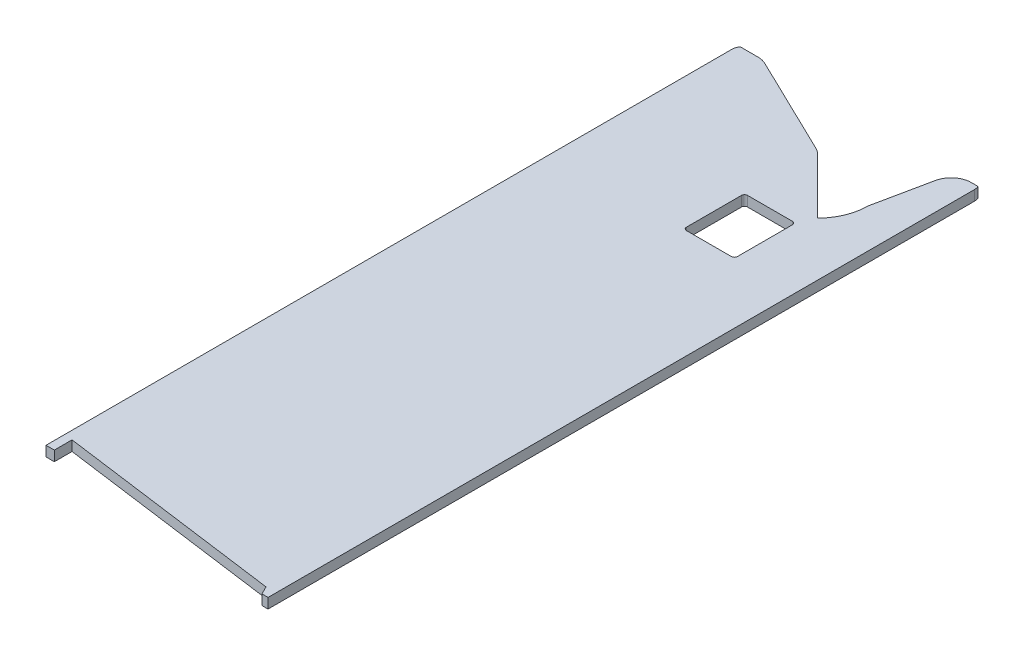
ISO-10303-21;
HEADER;
FILE_DESCRIPTION(('STEP AP214'),'2;1');
FILE_NAME('part.step','',(''),(''),'','','');
FILE_SCHEMA(('AUTOMOTIVE_DESIGN { 1 0 10303 214 1 1 1 1 }'));
ENDSEC;
DATA;
#1=APPLICATION_CONTEXT('core data for automotive mechanical design processes');
#2=APPLICATION_PROTOCOL_DEFINITION('international standard','automotive_design',2000,#1);
#3=PRODUCT_CONTEXT('',#1,'mechanical');
#4=PRODUCT('Part','Part','',(#3));
#5=PRODUCT_RELATED_PRODUCT_CATEGORY('part','',(#4));
#6=PRODUCT_DEFINITION_FORMATION('','',#4);
#7=PRODUCT_DEFINITION_CONTEXT('part definition',#1,'design');
#8=PRODUCT_DEFINITION('design','',#6,#7);
#9=PRODUCT_DEFINITION_SHAPE('','',#8);
#10=(LENGTH_UNIT() NAMED_UNIT(*) SI_UNIT(.MILLI.,.METRE.));
#11=(NAMED_UNIT(*) PLANE_ANGLE_UNIT() SI_UNIT($,.RADIAN.));
#12=(NAMED_UNIT(*) SI_UNIT($,.STERADIAN.) SOLID_ANGLE_UNIT());
#13=UNCERTAINTY_MEASURE_WITH_UNIT(LENGTH_MEASURE(1.E-05),#10,'distance_accuracy_value','');
#14=(GEOMETRIC_REPRESENTATION_CONTEXT(3) GLOBAL_UNCERTAINTY_ASSIGNED_CONTEXT((#13)) GLOBAL_UNIT_ASSIGNED_CONTEXT((#10,
#11,#12)) REPRESENTATION_CONTEXT('',''));
#15=CARTESIAN_POINT('',(0.,0.,0.));
#16=DIRECTION('',(0.,0.,1.));
#17=DIRECTION('',(1.,0.,0.));
#18=AXIS2_PLACEMENT_3D('',#15,#16,#17);
#19=CARTESIAN_POINT('',(-304.8,25.4,-914.4));
#20=DIRECTION('',(1.,0.,0.));
#21=DIRECTION('',(0.,0.,-1.));
#22=AXIS2_PLACEMENT_3D('',#19,#20,#21);
#23=PLANE('',#22);
#24=DIRECTION('',(0.,0.,1.));
#25=VECTOR('',#24,1.);
#26=CARTESIAN_POINT('',(-304.8,0.,-914.4));
#27=LINE('',#26,#25);
#28=CARTESIAN_POINT('',(-304.8,0.,-889.));
#29=VERTEX_POINT('',#28);
#30=CARTESIAN_POINT('',(-304.8,0.,833.12));
#31=VERTEX_POINT('',#30);
#32=EDGE_CURVE('E337',#29,#31,#27,.T.);
#33=ORIENTED_EDGE('',*,*,#32,.T.);
#34=DIRECTION('',(0.,1.,0.));
#35=VECTOR('',#34,1.);
#36=CARTESIAN_POINT('',(-304.8,25.4,833.12));
#37=LINE('',#36,#35);
#38=CARTESIAN_POINT('',(-304.8,25.4,833.12));
#39=VERTEX_POINT('',#38);
#40=EDGE_CURVE('E448',#31,#39,#37,.T.);
#41=ORIENTED_EDGE('',*,*,#40,.T.);
#42=DIRECTION('',(0.,0.,1.));
#43=VECTOR('',#42,1.);
#44=CARTESIAN_POINT('',(-304.8,25.4,-914.4));
#45=LINE('',#44,#43);
#46=CARTESIAN_POINT('',(-304.8,25.4,-889.));
#47=VERTEX_POINT('',#46);
#48=EDGE_CURVE('E372',#47,#39,#45,.T.);
#49=ORIENTED_EDGE('',*,*,#48,.F.);
#50=DIRECTION('',(0.,-1.,0.));
#51=VECTOR('',#50,1.);
#52=CARTESIAN_POINT('',(-304.8,25.4,-889.));
#53=LINE('',#52,#51);
#54=EDGE_CURVE('E344',#47,#29,#53,.T.);
#55=ORIENTED_EDGE('',*,*,#54,.T.);
#56=EDGE_LOOP('',(#33,#41,#49,#55));
#57=FACE_BOUND('',#56,.T.);
#58=ADVANCED_FACE('F32',(#57),#23,.F.);
#59=CARTESIAN_POINT('',(304.8,25.4,-914.4));
#60=DIRECTION('',(-1.,0.,0.));
#61=DIRECTION('',(0.,0.,1.));
#62=AXIS2_PLACEMENT_3D('',#59,#60,#61);
#63=PLANE('',#62);
#64=DIRECTION('',(0.,0.,-1.));
#65=VECTOR('',#64,1.);
#66=CARTESIAN_POINT('',(304.8,25.4,-914.4));
#67=LINE('',#66,#65);
#68=CARTESIAN_POINT('',(304.8,25.4,885.19));
#69=VERTEX_POINT('',#68);
#70=CARTESIAN_POINT('',(304.8,25.4,-889.));
#71=VERTEX_POINT('',#70);
#72=EDGE_CURVE('E369',#69,#71,#67,.T.);
#73=ORIENTED_EDGE('',*,*,#72,.F.);
#74=DIRECTION('',(0.,-1.,0.));
#75=VECTOR('',#74,1.);
#76=CARTESIAN_POINT('',(304.8,25.4,885.19));
#77=LINE('',#76,#75);
#78=CARTESIAN_POINT('',(304.8,0.,885.19));
#79=VERTEX_POINT('',#78);
#80=EDGE_CURVE('E371',#69,#79,#77,.T.);
#81=ORIENTED_EDGE('',*,*,#80,.T.);
#82=DIRECTION('',(0.,0.,-1.));
#83=VECTOR('',#82,1.);
#84=CARTESIAN_POINT('',(304.8,0.,-914.4));
#85=LINE('',#84,#83);
#86=CARTESIAN_POINT('',(304.8,0.,-889.));
#87=VERTEX_POINT('',#86);
#88=EDGE_CURVE('E370',#79,#87,#85,.T.);
#89=ORIENTED_EDGE('',*,*,#88,.T.);
#90=DIRECTION('',(0.,-1.,0.));
#91=VECTOR('',#90,1.);
#92=CARTESIAN_POINT('',(304.8,25.4,-889.));
#93=LINE('',#92,#91);
#94=EDGE_CURVE('E349',#87,#71,#93,.F.);
#95=ORIENTED_EDGE('',*,*,#94,.T.);
#96=EDGE_LOOP('',(#73,#81,#89,#95));
#97=FACE_BOUND('',#96,.T.);
#98=ADVANCED_FACE('F305',(#97),#63,.F.);
#99=CARTESIAN_POINT('',(0.,25.4,0.));
#100=DIRECTION('',(0.,-1.,0.));
#101=DIRECTION('',(0.,0.,-1.));
#102=AXIS2_PLACEMENT_3D('',#99,#100,#101);
#103=PLANE('',#102);
#104=DIRECTION('',(1.,0.,0.));
#105=VECTOR('',#104,1.);
#106=CARTESIAN_POINT('',(32.575480787915,25.4,-590.993358649177));
#107=LINE('',#106,#105);
#108=CARTESIAN_POINT('',(32.575480787915,25.4,-590.993358649177));
#109=VERTEX_POINT('',#108);
#110=CARTESIAN_POINT('',(145.224519212085,25.4,-590.993358649177));
#111=VERTEX_POINT('',#110);
#112=EDGE_CURVE('E218',#109,#111,#107,.T.);
#113=ORIENTED_EDGE('',*,*,#112,.T.);
#114=CARTESIAN_POINT('',(145.222197909482,25.4,-583.372197909482));
#115=DIRECTION('',(0.,-1.,0.));
#116=DIRECTION('',(-0.707106781186548,0.,0.707106781186548));
#117=AXIS2_PLACEMENT_3D('',#114,#115,#116);
#118=ELLIPSE('',#117,7.62232130262978,7.61999999999996);
#119=CARTESIAN_POINT('',(152.843358649177,25.4,-583.374519212085));
#120=VERTEX_POINT('',#119);
#121=EDGE_CURVE('E212',#111,#120,#118,.T.);
#122=ORIENTED_EDGE('',*,*,#121,.T.);
#123=DIRECTION('',(0.,0.,1.));
#124=VECTOR('',#123,1.);
#125=CARTESIAN_POINT('',(152.843358649177,25.4,-583.374519212085));
#126=LINE('',#125,#124);
#127=CARTESIAN_POINT('',(152.843358649177,25.4,-445.325480787915));
#128=VERTEX_POINT('',#127);
#129=EDGE_CURVE('E221',#120,#128,#126,.T.);
#130=ORIENTED_EDGE('',*,*,#129,.T.);
#131=CARTESIAN_POINT('',(145.222197909482,25.4,-445.327802090518));
#132=DIRECTION('',(0.,-1.,0.));
#133=DIRECTION('',(-0.707106781186548,0.,-0.707106781186548));
#134=AXIS2_PLACEMENT_3D('',#131,#132,#133);
#135=ELLIPSE('',#134,7.62232130262978,7.62000000000002);
#136=CARTESIAN_POINT('',(145.224519212085,25.4,-437.706641350823));
#137=VERTEX_POINT('',#136);
#138=EDGE_CURVE('E47',#128,#137,#135,.T.);
#139=ORIENTED_EDGE('',*,*,#138,.T.);
#140=DIRECTION('',(-1.,0.,0.));
#141=VECTOR('',#140,1.);
#142=CARTESIAN_POINT('',(145.224519212085,25.4,-437.706641350823));
#143=LINE('',#142,#141);
#144=CARTESIAN_POINT('',(32.575480787915,25.4,-437.706641350823));
#145=VERTEX_POINT('',#144);
#146=EDGE_CURVE('E541',#137,#145,#143,.T.);
#147=ORIENTED_EDGE('',*,*,#146,.T.);
#148=CARTESIAN_POINT('',(32.5778020905179,25.4,-445.327802090518));
#149=DIRECTION('',(0.,-1.,0.));
#150=DIRECTION('',(0.707106781186548,0.,-0.707106781186547));
#151=AXIS2_PLACEMENT_3D('',#148,#149,#150);
#152=ELLIPSE('',#151,7.62232130262979,7.62000000000001);
#153=CARTESIAN_POINT('',(24.9566413508233,25.4,-445.325480787915));
#154=VERTEX_POINT('',#153);
#155=EDGE_CURVE('E537',#145,#154,#152,.T.);
#156=ORIENTED_EDGE('',*,*,#155,.T.);
#157=DIRECTION('',(0.,0.,-1.));
#158=VECTOR('',#157,1.);
#159=CARTESIAN_POINT('',(24.9566413508233,25.4,-445.325480787915));
#160=LINE('',#159,#158);
#161=CARTESIAN_POINT('',(24.9566413508233,25.4,-583.374519212085));
#162=VERTEX_POINT('',#161);
#163=EDGE_CURVE('E520',#154,#162,#160,.T.);
#164=ORIENTED_EDGE('',*,*,#163,.T.);
#165=CARTESIAN_POINT('',(32.5778020905179,25.4,-583.372197909482));
#166=DIRECTION('',(0.,-1.,0.));
#167=DIRECTION('',(0.707106781186548,0.,0.707106781186547));
#168=AXIS2_PLACEMENT_3D('',#165,#166,#167);
#169=ELLIPSE('',#168,7.62232130262979,7.61999999999996);
#170=EDGE_CURVE('E517',#162,#109,#169,.T.);
#171=ORIENTED_EDGE('',*,*,#170,.T.);
#172=EDGE_LOOP('',(#113,#122,#130,#139,#147,#156,#164,#171));
#173=FACE_BOUND('',#172,.T.);
#174=DIRECTION('',(-0.447213595499958,0.,-0.894427190999916));
#175=VECTOR('',#174,1.);
#176=CARTESIAN_POINT('',(279.4,25.4,864.87));
#177=LINE('',#176,#175);
#178=CARTESIAN_POINT('',(289.56,25.4,885.19));
#179=VERTEX_POINT('',#178);
#180=CARTESIAN_POINT('',(279.4,25.4,864.87));
#181=VERTEX_POINT('',#180);
#182=EDGE_CURVE('E465',#179,#181,#177,.T.);
#183=ORIENTED_EDGE('',*,*,#182,.F.);
#184=DIRECTION('',(-1.,0.,0.));
#185=VECTOR('',#184,1.);
#186=CARTESIAN_POINT('',(289.56,25.4,885.19));
#187=LINE('',#186,#185);
#188=EDGE_CURVE('E468',#69,#179,#187,.T.);
#189=ORIENTED_EDGE('',*,*,#188,.F.);
#190=ORIENTED_EDGE('',*,*,#72,.T.);
#191=CARTESIAN_POINT('',(279.4,25.4,-889.));
#192=DIRECTION('',(0.,-1.,0.));
#193=DIRECTION('',(0.,0.,-1.));
#194=AXIS2_PLACEMENT_3D('',#191,#192,#193);
#195=CIRCLE('',#194,25.4);
#196=CARTESIAN_POINT('',(302.369269739192,25.4,-899.843092162673));
#197=VERTEX_POINT('',#196);
#198=EDGE_CURVE('E338',#71,#197,#195,.F.);
#199=ORIENTED_EDGE('',*,*,#198,.T.);
#200=DIRECTION('',(1.,0.,0.));
#201=VECTOR('',#200,1.);
#202=CARTESIAN_POINT('',(311.15,25.4,-899.843092162673));
#203=LINE('',#202,#201);
#204=CARTESIAN_POINT('',(285.75,25.4,-899.843092162673));
#205=VERTEX_POINT('',#204);
#206=EDGE_CURVE('E357',#205,#197,#203,.T.);
#207=ORIENTED_EDGE('',*,*,#206,.F.);
#208=CARTESIAN_POINT('',(285.75,25.4,-849.043092162673));
#209=DIRECTION('',(0.,-1.,0.));
#210=DIRECTION('',(0.,0.,1.));
#211=AXIS2_PLACEMENT_3D('',#208,#209,#210);
#212=CIRCLE('',#211,50.7999999999999);
#213=CARTESIAN_POINT('',(236.016540237662,25.4,-859.397945134489));
#214=VERTEX_POINT('',#213);
#215=EDGE_CURVE('E400',#214,#205,#212,.T.);
#216=ORIENTED_EDGE('',*,*,#215,.F.);
#217=DIRECTION('',(0.203835688421557,0.,-0.97900511343185));
#218=VECTOR('',#217,1.);
#219=CARTESIAN_POINT('',(236.016540237662,25.4,-859.397945134489));
#220=LINE('',#219,#218);
#221=CARTESIAN_POINT('',(207.824095772208,25.4,-723.992082179118));
#222=VERTEX_POINT('',#221);
#223=EDGE_CURVE('E403',#222,#214,#220,.T.);
#224=ORIENTED_EDGE('',*,*,#223,.F.);
#225=CARTESIAN_POINT('',(257.557555534546,25.4,-713.637229207303));
#226=DIRECTION('',(0.,-1.,0.));
#227=DIRECTION('',(0.,0.,1.));
#228=AXIS2_PLACEMENT_3D('',#225,#226,#227);
#229=CIRCLE('',#228,50.8000000000001);
#230=CARTESIAN_POINT('',(206.780966260343,25.4,-715.179299788981));
#231=VERTEX_POINT('',#230);
#232=EDGE_CURVE('E406',#231,#222,#229,.T.);
#233=ORIENTED_EDGE('',*,*,#232,.F.);
#234=CARTESIAN_POINT('',(78.74,25.4,-719.067867535307));
#235=DIRECTION('',(0.,1.,0.));
#236=DIRECTION('',(0.,0.,1.));
#237=AXIS2_PLACEMENT_3D('',#234,#235,#236);
#238=CIRCLE('',#237,128.1);
#239=CARTESIAN_POINT('',(170.129901321755,25.4,-629.30431181028));
#240=VERTEX_POINT('',#239);
#241=EDGE_CURVE('E409',#240,#231,#238,.T.);
#242=ORIENTED_EDGE('',*,*,#241,.F.);
#243=DIRECTION('',(0.707106781186546,0.,0.707106781186549));
#244=VECTOR('',#243,1.);
#245=CARTESIAN_POINT('',(30.050126241336,25.4,-769.3840868907));
#246=LINE('',#245,#244);
#247=CARTESIAN_POINT('',(30.0501262413361,25.4,-769.3840868907));
#248=VERTEX_POINT('',#247);
#249=EDGE_CURVE('E412',#248,#240,#246,.T.);
#250=ORIENTED_EDGE('',*,*,#249,.F.);
#251=CARTESIAN_POINT('',(-5.87089824294057,25.4,-733.463062406423));
#252=DIRECTION('',(0.,-1.,0.));
#253=DIRECTION('',(0.,0.,-1.));
#254=AXIS2_PLACEMENT_3D('',#251,#252,#253);
#255=CIRCLE('',#254,50.7999999999999);
#256=CARTESIAN_POINT('',(16.2515875688409,25.4,-779.193092162674));
#257=VERTEX_POINT('',#256);
#258=EDGE_CURVE('E415',#257,#248,#255,.T.);
#259=ORIENTED_EDGE('',*,*,#258,.F.);
#260=DIRECTION('',(0.900197436146657,0.,0.435482004168926));
#261=VECTOR('',#260,1.);
#262=CARTESIAN_POINT('',(16.2515875688409,25.4,-779.193092162674));
#263=LINE('',#262,#261);
#264=CARTESIAN_POINT('',(-233.147514188219,25.4,-899.843092162674));
#265=VERTEX_POINT('',#264);
#266=EDGE_CURVE('E418',#265,#257,#263,.T.);
#267=ORIENTED_EDGE('',*,*,#266,.F.);
#268=CARTESIAN_POINT('',(-255.27,25.4,-854.113062406423));
#269=DIRECTION('',(0.,-1.,0.));
#270=DIRECTION('',(0.,0.,1.));
#271=AXIS2_PLACEMENT_3D('',#268,#269,#270);
#272=CIRCLE('',#271,50.8000000000001);
#273=CARTESIAN_POINT('',(-255.27,25.4,-904.913062406423));
#274=VERTEX_POINT('',#273);
#275=EDGE_CURVE('E421',#274,#265,#272,.T.);
#276=ORIENTED_EDGE('',*,*,#275,.F.);
#277=DIRECTION('',(1.,0.,0.));
#278=VECTOR('',#277,1.);
#279=CARTESIAN_POINT('',(-255.27,25.4,-904.913062406423));
#280=LINE('',#279,#278);
#281=CARTESIAN_POINT('',(-299.197334286446,25.4,-904.913062406423));
#282=VERTEX_POINT('',#281);
#283=EDGE_CURVE('E424',#282,#274,#280,.T.);
#284=ORIENTED_EDGE('',*,*,#283,.F.);
#285=CARTESIAN_POINT('',(-279.4,25.4,-889.));
#286=DIRECTION('',(0.,-1.,0.));
#287=DIRECTION('',(0.,0.,-1.));
#288=AXIS2_PLACEMENT_3D('',#285,#286,#287);
#289=CIRCLE('',#288,25.4);
#290=EDGE_CURVE('E327',#282,#47,#289,.F.);
#291=ORIENTED_EDGE('',*,*,#290,.T.);
#292=ORIENTED_EDGE('',*,*,#48,.T.);
#293=DIRECTION('',(-1.,0.,0.));
#294=VECTOR('',#293,1.);
#295=CARTESIAN_POINT('',(-327.069996121906,25.4,833.12));
#296=LINE('',#295,#294);
#297=CARTESIAN_POINT('',(-283.889996121906,25.4,833.12));
#298=VERTEX_POINT('',#297);
#299=EDGE_CURVE('E470',#298,#39,#296,.T.);
#300=ORIENTED_EDGE('',*,*,#299,.F.);
#301=DIRECTION('',(0.,0.,1.));
#302=VECTOR('',#301,1.);
#303=CARTESIAN_POINT('',(-283.889996121906,25.4,833.12));
#304=LINE('',#303,#302);
#305=CARTESIAN_POINT('',(-283.889996121906,25.4,788.67));
#306=VERTEX_POINT('',#305);
#307=EDGE_CURVE('E472',#306,#298,#304,.T.);
#308=ORIENTED_EDGE('',*,*,#307,.F.);
#309=DIRECTION('',(-0.990973805870857,0.,-0.134055645453034));
#310=VECTOR('',#309,1.);
#311=CARTESIAN_POINT('',(-283.889996121906,25.4,788.67));
#312=LINE('',#311,#310);
#313=EDGE_CURVE('E461',#181,#306,#312,.T.);
#314=ORIENTED_EDGE('',*,*,#313,.F.);
#315=EDGE_LOOP('',(#183,#189,#190,#199,#207,#216,#224,#233,#242,#250,#259,#267,#276,#284,#291,
#292,#300,#308,#314));
#316=FACE_BOUND('',#315,.T.);
#317=ADVANCED_FACE('F225',(#173,#316),#103,.F.);
#318=CARTESIAN_POINT('',(0.,0.,0.));
#319=DIRECTION('',(0.,-1.,0.));
#320=DIRECTION('',(0.,0.,-1.));
#321=AXIS2_PLACEMENT_3D('',#318,#319,#320);
#322=PLANE('',#321);
#323=CARTESIAN_POINT('',(145.222197909482,0.,-583.372197909482));
#324=DIRECTION('',(0.,-1.,0.));
#325=DIRECTION('',(-0.707106781186548,0.,0.707106781186548));
#326=AXIS2_PLACEMENT_3D('',#323,#324,#325);
#327=ELLIPSE('',#326,7.62232130262978,7.61999999999996);
#328=CARTESIAN_POINT('',(145.224519212085,0.,-590.993358649177));
#329=VERTEX_POINT('',#328);
#330=CARTESIAN_POINT('',(152.843358649177,0.,-583.374519212085));
#331=VERTEX_POINT('',#330);
#332=EDGE_CURVE('E55',#329,#331,#327,.T.);
#333=ORIENTED_EDGE('',*,*,#332,.F.);
#334=DIRECTION('',(1.,0.,0.));
#335=VECTOR('',#334,1.);
#336=CARTESIAN_POINT('',(32.575480787915,0.,-590.993358649177));
#337=LINE('',#336,#335);
#338=CARTESIAN_POINT('',(32.575480787915,0.,-590.993358649177));
#339=VERTEX_POINT('',#338);
#340=EDGE_CURVE('E229',#339,#329,#337,.T.);
#341=ORIENTED_EDGE('',*,*,#340,.F.);
#342=CARTESIAN_POINT('',(32.5778020905179,0.,-583.372197909482));
#343=DIRECTION('',(0.,-1.,0.));
#344=DIRECTION('',(0.707106781186548,0.,0.707106781186547));
#345=AXIS2_PLACEMENT_3D('',#342,#343,#344);
#346=ELLIPSE('',#345,7.62232130262979,7.61999999999996);
#347=CARTESIAN_POINT('',(24.9566413508233,0.,-583.374519212085));
#348=VERTEX_POINT('',#347);
#349=EDGE_CURVE('E232',#348,#339,#346,.T.);
#350=ORIENTED_EDGE('',*,*,#349,.F.);
#351=DIRECTION('',(0.,0.,-1.));
#352=VECTOR('',#351,1.);
#353=CARTESIAN_POINT('',(24.9566413508233,0.,-445.325480787915));
#354=LINE('',#353,#352);
#355=CARTESIAN_POINT('',(24.9566413508233,0.,-445.325480787915));
#356=VERTEX_POINT('',#355);
#357=EDGE_CURVE('E501',#356,#348,#354,.T.);
#358=ORIENTED_EDGE('',*,*,#357,.F.);
#359=CARTESIAN_POINT('',(32.5778020905179,0.,-445.327802090518));
#360=DIRECTION('',(0.,-1.,0.));
#361=DIRECTION('',(0.707106781186548,0.,-0.707106781186547));
#362=AXIS2_PLACEMENT_3D('',#359,#360,#361);
#363=ELLIPSE('',#362,7.62232130262979,7.62000000000001);
#364=CARTESIAN_POINT('',(32.575480787915,0.,-437.706641350823));
#365=VERTEX_POINT('',#364);
#366=EDGE_CURVE('E504',#365,#356,#363,.T.);
#367=ORIENTED_EDGE('',*,*,#366,.F.);
#368=DIRECTION('',(-1.,0.,0.));
#369=VECTOR('',#368,1.);
#370=CARTESIAN_POINT('',(145.224519212085,0.,-437.706641350823));
#371=LINE('',#370,#369);
#372=CARTESIAN_POINT('',(145.224519212085,0.,-437.706641350823));
#373=VERTEX_POINT('',#372);
#374=EDGE_CURVE('E507',#373,#365,#371,.T.);
#375=ORIENTED_EDGE('',*,*,#374,.F.);
#376=CARTESIAN_POINT('',(145.222197909482,0.,-445.327802090518));
#377=DIRECTION('',(0.,-1.,0.));
#378=DIRECTION('',(-0.707106781186548,0.,-0.707106781186548));
#379=AXIS2_PLACEMENT_3D('',#376,#377,#378);
#380=ELLIPSE('',#379,7.62232130262978,7.62000000000002);
#381=CARTESIAN_POINT('',(152.843358649177,0.,-445.325480787915));
#382=VERTEX_POINT('',#381);
#383=EDGE_CURVE('E510',#382,#373,#380,.T.);
#384=ORIENTED_EDGE('',*,*,#383,.F.);
#385=DIRECTION('',(0.,0.,1.));
#386=VECTOR('',#385,1.);
#387=CARTESIAN_POINT('',(152.843358649177,0.,-583.374519212085));
#388=LINE('',#387,#386);
#389=EDGE_CURVE('E513',#331,#382,#388,.T.);
#390=ORIENTED_EDGE('',*,*,#389,.F.);
#391=EDGE_LOOP('',(#333,#341,#350,#358,#367,#375,#384,#390));
#392=FACE_BOUND('',#391,.T.);
#393=DIRECTION('',(-1.,0.,0.));
#394=VECTOR('',#393,1.);
#395=CARTESIAN_POINT('',(289.56,0.,885.19));
#396=LINE('',#395,#394);
#397=CARTESIAN_POINT('',(289.56,0.,885.19));
#398=VERTEX_POINT('',#397);
#399=EDGE_CURVE('E481',#79,#398,#396,.T.);
#400=ORIENTED_EDGE('',*,*,#399,.T.);
#401=DIRECTION('',(-0.447213595499958,0.,-0.894427190999916));
#402=VECTOR('',#401,1.);
#403=CARTESIAN_POINT('',(279.4,0.,864.87));
#404=LINE('',#403,#402);
#405=CARTESIAN_POINT('',(279.4,0.,864.87));
#406=VERTEX_POINT('',#405);
#407=EDGE_CURVE('E478',#398,#406,#404,.T.);
#408=ORIENTED_EDGE('',*,*,#407,.T.);
#409=DIRECTION('',(-0.990973805870857,0.,-0.134055645453034));
#410=VECTOR('',#409,1.);
#411=CARTESIAN_POINT('',(-283.889996121906,0.,788.67));
#412=LINE('',#411,#410);
#413=CARTESIAN_POINT('',(-283.889996121906,0.,788.67));
#414=VERTEX_POINT('',#413);
#415=EDGE_CURVE('E455',#406,#414,#412,.T.);
#416=ORIENTED_EDGE('',*,*,#415,.T.);
#417=DIRECTION('',(0.,0.,1.));
#418=VECTOR('',#417,1.);
#419=CARTESIAN_POINT('',(-283.889996121906,0.,833.12));
#420=LINE('',#419,#418);
#421=CARTESIAN_POINT('',(-283.889996121906,0.,833.12));
#422=VERTEX_POINT('',#421);
#423=EDGE_CURVE('E464',#414,#422,#420,.T.);
#424=ORIENTED_EDGE('',*,*,#423,.T.);
#425=DIRECTION('',(-1.,0.,0.));
#426=VECTOR('',#425,1.);
#427=CARTESIAN_POINT('',(-327.069996121906,0.,833.12));
#428=LINE('',#427,#426);
#429=EDGE_CURVE('E483',#422,#31,#428,.T.);
#430=ORIENTED_EDGE('',*,*,#429,.T.);
#431=ORIENTED_EDGE('',*,*,#32,.F.);
#432=CARTESIAN_POINT('',(-279.4,0.,-889.));
#433=DIRECTION('',(0.,-1.,0.));
#434=DIRECTION('',(0.,0.,-1.));
#435=AXIS2_PLACEMENT_3D('',#432,#433,#434);
#436=CIRCLE('',#435,25.4);
#437=CARTESIAN_POINT('',(-299.197334286446,0.,-904.913062406423));
#438=VERTEX_POINT('',#437);
#439=EDGE_CURVE('E325',#29,#438,#436,.T.);
#440=ORIENTED_EDGE('',*,*,#439,.T.);
#441=DIRECTION('',(1.,0.,0.));
#442=VECTOR('',#441,1.);
#443=CARTESIAN_POINT('',(-255.27,0.,-904.913062406423));
#444=LINE('',#443,#442);
#445=CARTESIAN_POINT('',(-255.27,0.,-904.913062406423));
#446=VERTEX_POINT('',#445);
#447=EDGE_CURVE('E334',#438,#446,#444,.T.);
#448=ORIENTED_EDGE('',*,*,#447,.T.);
#449=CARTESIAN_POINT('',(-255.27,0.,-854.113062406423));
#450=DIRECTION('',(0.,-1.,0.));
#451=DIRECTION('',(0.,0.,1.));
#452=AXIS2_PLACEMENT_3D('',#449,#450,#451);
#453=CIRCLE('',#452,50.8000000000001);
#454=CARTESIAN_POINT('',(-233.147514188219,0.,-899.843092162674));
#455=VERTEX_POINT('',#454);
#456=EDGE_CURVE('E444',#446,#455,#453,.T.);
#457=ORIENTED_EDGE('',*,*,#456,.T.);
#458=DIRECTION('',(0.900197436146657,0.,0.435482004168926));
#459=VECTOR('',#458,1.);
#460=CARTESIAN_POINT('',(16.2515875688409,0.,-779.193092162674));
#461=LINE('',#460,#459);
#462=CARTESIAN_POINT('',(16.2515875688409,0.,-779.193092162674));
#463=VERTEX_POINT('',#462);
#464=EDGE_CURVE('E441',#455,#463,#461,.T.);
#465=ORIENTED_EDGE('',*,*,#464,.T.);
#466=CARTESIAN_POINT('',(-5.87089824294057,0.,-733.463062406423));
#467=DIRECTION('',(0.,-1.,0.));
#468=DIRECTION('',(0.,0.,-1.));
#469=AXIS2_PLACEMENT_3D('',#466,#467,#468);
#470=CIRCLE('',#469,50.7999999999999);
#471=CARTESIAN_POINT('',(30.0501262413361,0.,-769.3840868907));
#472=VERTEX_POINT('',#471);
#473=EDGE_CURVE('E438',#463,#472,#470,.T.);
#474=ORIENTED_EDGE('',*,*,#473,.T.);
#475=DIRECTION('',(0.707106781186546,0.,0.707106781186549));
#476=VECTOR('',#475,1.);
#477=CARTESIAN_POINT('',(30.050126241336,0.,-769.3840868907));
#478=LINE('',#477,#476);
#479=CARTESIAN_POINT('',(170.129901321755,0.,-629.30431181028));
#480=VERTEX_POINT('',#479);
#481=EDGE_CURVE('E435',#472,#480,#478,.T.);
#482=ORIENTED_EDGE('',*,*,#481,.T.);
#483=CARTESIAN_POINT('',(78.74,0.,-719.067867535307));
#484=DIRECTION('',(0.,1.,0.));
#485=DIRECTION('',(0.,0.,1.));
#486=AXIS2_PLACEMENT_3D('',#483,#484,#485);
#487=CIRCLE('',#486,128.1);
#488=CARTESIAN_POINT('',(206.780966260343,0.,-715.179299788981));
#489=VERTEX_POINT('',#488);
#490=EDGE_CURVE('E432',#480,#489,#487,.T.);
#491=ORIENTED_EDGE('',*,*,#490,.T.);
#492=CARTESIAN_POINT('',(257.557555534546,0.,-713.637229207303));
#493=DIRECTION('',(0.,-1.,0.));
#494=DIRECTION('',(0.,0.,1.));
#495=AXIS2_PLACEMENT_3D('',#492,#493,#494);
#496=CIRCLE('',#495,50.8000000000001);
#497=CARTESIAN_POINT('',(207.824095772208,0.,-723.992082179118));
#498=VERTEX_POINT('',#497);
#499=EDGE_CURVE('E429',#489,#498,#496,.T.);
#500=ORIENTED_EDGE('',*,*,#499,.T.);
#501=DIRECTION('',(0.203835688421557,0.,-0.97900511343185));
#502=VECTOR('',#501,1.);
#503=CARTESIAN_POINT('',(236.016540237662,0.,-859.397945134489));
#504=LINE('',#503,#502);
#505=CARTESIAN_POINT('',(236.016540237662,0.,-859.397945134489));
#506=VERTEX_POINT('',#505);
#507=EDGE_CURVE('E427',#498,#506,#504,.T.);
#508=ORIENTED_EDGE('',*,*,#507,.T.);
#509=CARTESIAN_POINT('',(285.75,0.,-849.043092162673));
#510=DIRECTION('',(0.,-1.,0.));
#511=DIRECTION('',(0.,0.,1.));
#512=AXIS2_PLACEMENT_3D('',#509,#510,#511);
#513=CIRCLE('',#512,50.7999999999999);
#514=CARTESIAN_POINT('',(285.75,0.,-899.843092162673));
#515=VERTEX_POINT('',#514);
#516=EDGE_CURVE('E364',#506,#515,#513,.T.);
#517=ORIENTED_EDGE('',*,*,#516,.T.);
#518=DIRECTION('',(1.,0.,0.));
#519=VECTOR('',#518,1.);
#520=CARTESIAN_POINT('',(311.15,0.,-899.843092162673));
#521=LINE('',#520,#519);
#522=CARTESIAN_POINT('',(302.369269739192,0.,-899.843092162673));
#523=VERTEX_POINT('',#522);
#524=EDGE_CURVE('E354',#515,#523,#521,.T.);
#525=ORIENTED_EDGE('',*,*,#524,.T.);
#526=CARTESIAN_POINT('',(279.4,0.,-889.));
#527=DIRECTION('',(0.,-1.,0.));
#528=DIRECTION('',(0.,0.,-1.));
#529=AXIS2_PLACEMENT_3D('',#526,#527,#528);
#530=CIRCLE('',#529,25.4);
#531=EDGE_CURVE('E339',#523,#87,#530,.T.);
#532=ORIENTED_EDGE('',*,*,#531,.T.);
#533=ORIENTED_EDGE('',*,*,#88,.F.);
#534=EDGE_LOOP('',(#400,#408,#416,#424,#430,#431,#440,#448,#457,#465,#474,#482,#491,#500,#508,
#517,#525,#532,#533));
#535=FACE_BOUND('',#534,.T.);
#536=ADVANCED_FACE('F304',(#392,#535),#322,.T.);
#537=CARTESIAN_POINT('',(-279.4,25.4,-889.));
#538=DIRECTION('',(0.,-1.,0.));
#539=DIRECTION('',(0.,0.,-1.));
#540=AXIS2_PLACEMENT_3D('',#537,#538,#539);
#541=CYLINDRICAL_SURFACE('',#540,25.4);
#542=DIRECTION('',(0.,-1.,0.));
#543=VECTOR('',#542,1.);
#544=CARTESIAN_POINT('',(-299.197334286446,25.4,-904.913062406423));
#545=LINE('',#544,#543);
#546=EDGE_CURVE('E11',#438,#282,#545,.F.);
#547=ORIENTED_EDGE('',*,*,#546,.F.);
#548=ORIENTED_EDGE('',*,*,#439,.F.);
#549=ORIENTED_EDGE('',*,*,#54,.F.);
#550=ORIENTED_EDGE('',*,*,#290,.F.);
#551=EDGE_LOOP('',(#547,#548,#549,#550));
#552=FACE_BOUND('',#551,.T.);
#553=ADVANCED_FACE('F308',(#552),#541,.T.);
#554=CARTESIAN_POINT('',(279.4,25.4,-889.));
#555=DIRECTION('',(0.,-1.,0.));
#556=DIRECTION('',(0.,0.,-1.));
#557=AXIS2_PLACEMENT_3D('',#554,#555,#556);
#558=CYLINDRICAL_SURFACE('',#557,25.4);
#559=DIRECTION('',(0.,-1.,0.));
#560=VECTOR('',#559,1.);
#561=CARTESIAN_POINT('',(302.369269739192,25.4,-899.843092162673));
#562=LINE('',#561,#560);
#563=EDGE_CURVE('E40',#197,#523,#562,.T.);
#564=ORIENTED_EDGE('',*,*,#563,.F.);
#565=ORIENTED_EDGE('',*,*,#198,.F.);
#566=ORIENTED_EDGE('',*,*,#94,.F.);
#567=ORIENTED_EDGE('',*,*,#531,.F.);
#568=EDGE_LOOP('',(#564,#565,#566,#567));
#569=FACE_BOUND('',#568,.T.);
#570=ADVANCED_FACE('F34',(#569),#558,.T.);
#571=CARTESIAN_POINT('',(311.15,0.,-899.843092162673));
#572=DIRECTION('',(0.,0.,1.));
#573=DIRECTION('',(1.,0.,0.));
#574=AXIS2_PLACEMENT_3D('',#571,#572,#573);
#575=PLANE('',#574);
#576=ORIENTED_EDGE('',*,*,#563,.T.);
#577=ORIENTED_EDGE('',*,*,#524,.F.);
#578=DIRECTION('',(0.,1.,0.));
#579=VECTOR('',#578,1.);
#580=CARTESIAN_POINT('',(285.75,0.,-899.843092162673));
#581=LINE('',#580,#579);
#582=EDGE_CURVE('E376',#515,#205,#581,.T.);
#583=ORIENTED_EDGE('',*,*,#582,.T.);
#584=ORIENTED_EDGE('',*,*,#206,.T.);
#585=EDGE_LOOP('',(#576,#577,#583,#584));
#586=FACE_BOUND('',#585,.T.);
#587=ADVANCED_FACE('F263',(#586),#575,.F.);
#588=CARTESIAN_POINT('',(285.75,0.,-849.043092162673));
#589=DIRECTION('',(0.,1.,0.));
#590=DIRECTION('',(0.,0.,1.));
#591=AXIS2_PLACEMENT_3D('',#588,#589,#590);
#592=CYLINDRICAL_SURFACE('',#591,50.7999999999999);
#593=ORIENTED_EDGE('',*,*,#215,.T.);
#594=ORIENTED_EDGE('',*,*,#582,.F.);
#595=ORIENTED_EDGE('',*,*,#516,.F.);
#596=DIRECTION('',(0.,1.,0.));
#597=VECTOR('',#596,1.);
#598=CARTESIAN_POINT('',(236.016540237662,0.,-859.397945134489));
#599=LINE('',#598,#597);
#600=EDGE_CURVE('E396',#506,#214,#599,.T.);
#601=ORIENTED_EDGE('',*,*,#600,.T.);
#602=EDGE_LOOP('',(#593,#594,#595,#601));
#603=FACE_BOUND('',#602,.T.);
#604=ADVANCED_FACE('F266',(#603),#592,.T.);
#605=CARTESIAN_POINT('',(236.016540237662,0.,-859.397945134489));
#606=DIRECTION('',(0.97900511343185,0.,0.203835688421557));
#607=DIRECTION('',(0.203835688421557,0.,-0.97900511343185));
#608=AXIS2_PLACEMENT_3D('',#605,#606,#607);
#609=PLANE('',#608);
#610=ORIENTED_EDGE('',*,*,#223,.T.);
#611=ORIENTED_EDGE('',*,*,#600,.F.);
#612=ORIENTED_EDGE('',*,*,#507,.F.);
#613=DIRECTION('',(0.,1.,0.));
#614=VECTOR('',#613,1.);
#615=CARTESIAN_POINT('',(207.824095772208,0.,-723.992082179118));
#616=LINE('',#615,#614);
#617=EDGE_CURVE('E394',#498,#222,#616,.T.);
#618=ORIENTED_EDGE('',*,*,#617,.T.);
#619=EDGE_LOOP('',(#610,#611,#612,#618));
#620=FACE_BOUND('',#619,.T.);
#621=ADVANCED_FACE('F270',(#620),#609,.F.);
#622=CARTESIAN_POINT('',(257.557555534546,0.,-713.637229207303));
#623=DIRECTION('',(0.,1.,0.));
#624=DIRECTION('',(0.,0.,1.));
#625=AXIS2_PLACEMENT_3D('',#622,#623,#624);
#626=CYLINDRICAL_SURFACE('',#625,50.8000000000001);
#627=ORIENTED_EDGE('',*,*,#232,.T.);
#628=ORIENTED_EDGE('',*,*,#617,.F.);
#629=ORIENTED_EDGE('',*,*,#499,.F.);
#630=DIRECTION('',(0.,1.,0.));
#631=VECTOR('',#630,1.);
#632=CARTESIAN_POINT('',(206.780966260343,0.,-715.179299788981));
#633=LINE('',#632,#631);
#634=EDGE_CURVE('E392',#489,#231,#633,.T.);
#635=ORIENTED_EDGE('',*,*,#634,.T.);
#636=EDGE_LOOP('',(#627,#628,#629,#635));
#637=FACE_BOUND('',#636,.T.);
#638=ADVANCED_FACE('F274',(#637),#626,.T.);
#639=CARTESIAN_POINT('',(78.74,0.,-719.067867535307));
#640=DIRECTION('',(0.,1.,0.));
#641=DIRECTION('',(0.,0.,1.));
#642=AXIS2_PLACEMENT_3D('',#639,#640,#641);
#643=CYLINDRICAL_SURFACE('',#642,128.1);
#644=ORIENTED_EDGE('',*,*,#241,.T.);
#645=ORIENTED_EDGE('',*,*,#634,.F.);
#646=ORIENTED_EDGE('',*,*,#490,.F.);
#647=DIRECTION('',(0.,1.,0.));
#648=VECTOR('',#647,1.);
#649=CARTESIAN_POINT('',(170.129901321755,0.,-629.30431181028));
#650=LINE('',#649,#648);
#651=EDGE_CURVE('E390',#480,#240,#650,.T.);
#652=ORIENTED_EDGE('',*,*,#651,.T.);
#653=EDGE_LOOP('',(#644,#645,#646,#652));
#654=FACE_BOUND('',#653,.T.);
#655=ADVANCED_FACE('F278',(#654),#643,.F.);
#656=CARTESIAN_POINT('',(30.050126241336,0.,-769.3840868907));
#657=DIRECTION('',(-0.707106781186548,0.,0.707106781186546));
#658=DIRECTION('',(0.707106781186547,0.,0.707106781186549));
#659=AXIS2_PLACEMENT_3D('',#656,#657,#658);
#660=PLANE('',#659);
#661=ORIENTED_EDGE('',*,*,#249,.T.);
#662=ORIENTED_EDGE('',*,*,#651,.F.);
#663=ORIENTED_EDGE('',*,*,#481,.F.);
#664=DIRECTION('',(0.,1.,0.));
#665=VECTOR('',#664,1.);
#666=CARTESIAN_POINT('',(30.0501262413361,0.,-769.3840868907));
#667=LINE('',#666,#665);
#668=EDGE_CURVE('E388',#472,#248,#667,.T.);
#669=ORIENTED_EDGE('',*,*,#668,.T.);
#670=EDGE_LOOP('',(#661,#662,#663,#669));
#671=FACE_BOUND('',#670,.T.);
#672=ADVANCED_FACE('F282',(#671),#660,.F.);
#673=CARTESIAN_POINT('',(-5.87089824294057,0.,-733.463062406423));
#674=DIRECTION('',(0.,1.,0.));
#675=DIRECTION('',(0.,0.,1.));
#676=AXIS2_PLACEMENT_3D('',#673,#674,#675);
#677=CYLINDRICAL_SURFACE('',#676,50.7999999999999);
#678=ORIENTED_EDGE('',*,*,#258,.T.);
#679=ORIENTED_EDGE('',*,*,#668,.F.);
#680=ORIENTED_EDGE('',*,*,#473,.F.);
#681=DIRECTION('',(0.,1.,0.));
#682=VECTOR('',#681,1.);
#683=CARTESIAN_POINT('',(16.2515875688409,0.,-779.193092162674));
#684=LINE('',#683,#682);
#685=EDGE_CURVE('E386',#463,#257,#684,.T.);
#686=ORIENTED_EDGE('',*,*,#685,.T.);
#687=EDGE_LOOP('',(#678,#679,#680,#686));
#688=FACE_BOUND('',#687,.T.);
#689=ADVANCED_FACE('F286',(#688),#677,.T.);
#690=CARTESIAN_POINT('',(16.2515875688409,0.,-779.193092162674));
#691=DIRECTION('',(-0.435482004168926,0.,0.900197436146657));
#692=DIRECTION('',(0.900197436146657,0.,0.435482004168926));
#693=AXIS2_PLACEMENT_3D('',#690,#691,#692);
#694=PLANE('',#693);
#695=ORIENTED_EDGE('',*,*,#266,.T.);
#696=ORIENTED_EDGE('',*,*,#685,.F.);
#697=ORIENTED_EDGE('',*,*,#464,.F.);
#698=DIRECTION('',(0.,1.,0.));
#699=VECTOR('',#698,1.);
#700=CARTESIAN_POINT('',(-233.147514188219,0.,-899.843092162674));
#701=LINE('',#700,#699);
#702=EDGE_CURVE('E384',#455,#265,#701,.T.);
#703=ORIENTED_EDGE('',*,*,#702,.T.);
#704=EDGE_LOOP('',(#695,#696,#697,#703));
#705=FACE_BOUND('',#704,.T.);
#706=ADVANCED_FACE('F290',(#705),#694,.F.);
#707=CARTESIAN_POINT('',(-255.27,0.,-854.113062406423));
#708=DIRECTION('',(0.,1.,0.));
#709=DIRECTION('',(0.,0.,1.));
#710=AXIS2_PLACEMENT_3D('',#707,#708,#709);
#711=CYLINDRICAL_SURFACE('',#710,50.8000000000001);
#712=ORIENTED_EDGE('',*,*,#275,.T.);
#713=ORIENTED_EDGE('',*,*,#702,.F.);
#714=ORIENTED_EDGE('',*,*,#456,.F.);
#715=DIRECTION('',(0.,1.,0.));
#716=VECTOR('',#715,1.);
#717=CARTESIAN_POINT('',(-255.27,0.,-904.913062406423));
#718=LINE('',#717,#716);
#719=EDGE_CURVE('E365',#446,#274,#718,.T.);
#720=ORIENTED_EDGE('',*,*,#719,.T.);
#721=EDGE_LOOP('',(#712,#713,#714,#720));
#722=FACE_BOUND('',#721,.T.);
#723=ADVANCED_FACE('F294',(#722),#711,.T.);
#724=CARTESIAN_POINT('',(-255.27,0.,-904.913062406423));
#725=DIRECTION('',(0.,0.,1.));
#726=DIRECTION('',(1.,0.,0.));
#727=AXIS2_PLACEMENT_3D('',#724,#725,#726);
#728=PLANE('',#727);
#729=ORIENTED_EDGE('',*,*,#546,.T.);
#730=ORIENTED_EDGE('',*,*,#283,.T.);
#731=ORIENTED_EDGE('',*,*,#719,.F.);
#732=ORIENTED_EDGE('',*,*,#447,.F.);
#733=EDGE_LOOP('',(#729,#730,#731,#732));
#734=FACE_BOUND('',#733,.T.);
#735=ADVANCED_FACE('F255',(#734),#728,.F.);
#736=CARTESIAN_POINT('',(289.56,0.,885.19));
#737=DIRECTION('',(0.,0.,-1.));
#738=DIRECTION('',(-1.,0.,0.));
#739=AXIS2_PLACEMENT_3D('',#736,#737,#738);
#740=PLANE('',#739);
#741=ORIENTED_EDGE('',*,*,#188,.T.);
#742=DIRECTION('',(0.,1.,0.));
#743=VECTOR('',#742,1.);
#744=CARTESIAN_POINT('',(289.56,0.,885.19));
#745=LINE('',#744,#743);
#746=EDGE_CURVE('E454',#398,#179,#745,.T.);
#747=ORIENTED_EDGE('',*,*,#746,.F.);
#748=ORIENTED_EDGE('',*,*,#399,.F.);
#749=ORIENTED_EDGE('',*,*,#80,.F.);
#750=EDGE_LOOP('',(#741,#747,#748,#749));
#751=FACE_BOUND('',#750,.T.);
#752=ADVANCED_FACE('F251',(#751),#740,.F.);
#753=CARTESIAN_POINT('',(-327.069996121906,0.,833.12));
#754=DIRECTION('',(0.,0.,-1.));
#755=DIRECTION('',(-1.,0.,0.));
#756=AXIS2_PLACEMENT_3D('',#753,#754,#755);
#757=PLANE('',#756);
#758=ORIENTED_EDGE('',*,*,#429,.F.);
#759=DIRECTION('',(0.,1.,0.));
#760=VECTOR('',#759,1.);
#761=CARTESIAN_POINT('',(-283.889996121906,0.,833.12));
#762=LINE('',#761,#760);
#763=EDGE_CURVE('E452',#422,#298,#762,.T.);
#764=ORIENTED_EDGE('',*,*,#763,.T.);
#765=ORIENTED_EDGE('',*,*,#299,.T.);
#766=ORIENTED_EDGE('',*,*,#40,.F.);
#767=EDGE_LOOP('',(#758,#764,#765,#766));
#768=FACE_BOUND('',#767,.T.);
#769=ADVANCED_FACE('F254',(#768),#757,.F.);
#770=CARTESIAN_POINT('',(-283.889996121906,0.,833.12));
#771=DIRECTION('',(-1.,0.,0.));
#772=DIRECTION('',(0.,0.,1.));
#773=AXIS2_PLACEMENT_3D('',#770,#771,#772);
#774=PLANE('',#773);
#775=ORIENTED_EDGE('',*,*,#307,.T.);
#776=ORIENTED_EDGE('',*,*,#763,.F.);
#777=ORIENTED_EDGE('',*,*,#423,.F.);
#778=DIRECTION('',(0.,1.,0.));
#779=VECTOR('',#778,1.);
#780=CARTESIAN_POINT('',(-283.889996121906,0.,788.67));
#781=LINE('',#780,#779);
#782=EDGE_CURVE('E451',#414,#306,#781,.T.);
#783=ORIENTED_EDGE('',*,*,#782,.T.);
#784=EDGE_LOOP('',(#775,#776,#777,#783));
#785=FACE_BOUND('',#784,.T.);
#786=ADVANCED_FACE('F246',(#785),#774,.F.);
#787=CARTESIAN_POINT('',(-283.889996121906,0.,788.67));
#788=DIRECTION('',(0.134055645453034,0.,-0.990973805870857));
#789=DIRECTION('',(-0.990973805870857,0.,-0.134055645453034));
#790=AXIS2_PLACEMENT_3D('',#787,#788,#789);
#791=PLANE('',#790);
#792=ORIENTED_EDGE('',*,*,#313,.T.);
#793=ORIENTED_EDGE('',*,*,#782,.F.);
#794=ORIENTED_EDGE('',*,*,#415,.F.);
#795=DIRECTION('',(0.,1.,0.));
#796=VECTOR('',#795,1.);
#797=CARTESIAN_POINT('',(279.4,0.,864.87));
#798=LINE('',#797,#796);
#799=EDGE_CURVE('E458',#406,#181,#798,.T.);
#800=ORIENTED_EDGE('',*,*,#799,.T.);
#801=EDGE_LOOP('',(#792,#793,#794,#800));
#802=FACE_BOUND('',#801,.T.);
#803=ADVANCED_FACE('F243',(#802),#791,.F.);
#804=CARTESIAN_POINT('',(279.4,0.,864.87));
#805=DIRECTION('',(0.894427190999916,0.,-0.447213595499958));
#806=DIRECTION('',(-0.447213595499958,0.,-0.894427190999916));
#807=AXIS2_PLACEMENT_3D('',#804,#805,#806);
#808=PLANE('',#807);
#809=ORIENTED_EDGE('',*,*,#182,.T.);
#810=ORIENTED_EDGE('',*,*,#799,.F.);
#811=ORIENTED_EDGE('',*,*,#407,.F.);
#812=ORIENTED_EDGE('',*,*,#746,.T.);
#813=EDGE_LOOP('',(#809,#810,#811,#812));
#814=FACE_BOUND('',#813,.T.);
#815=ADVANCED_FACE('F241',(#814),#808,.F.);
#816=DIRECTION('',(0.,-1.,0.));
#817=VECTOR('',#816,1.);
#818=SURFACE_OF_LINEAR_EXTRUSION('',#118,#817);
#819=ORIENTED_EDGE('',*,*,#332,.T.);
#820=DIRECTION('',(0.,-1.,0.));
#821=VECTOR('',#820,1.);
#822=CARTESIAN_POINT('',(152.843358649177,25.4,-583.374519212085));
#823=LINE('',#822,#821);
#824=EDGE_CURVE('E208',#120,#331,#823,.T.);
#825=ORIENTED_EDGE('',*,*,#824,.F.);
#826=ORIENTED_EDGE('',*,*,#121,.F.);
#827=DIRECTION('',(0.,-1.,0.));
#828=VECTOR('',#827,1.);
#829=CARTESIAN_POINT('',(145.224519212085,25.4,-590.993358649177));
#830=LINE('',#829,#828);
#831=EDGE_CURVE('E475',#111,#329,#830,.T.);
#832=ORIENTED_EDGE('',*,*,#831,.T.);
#833=EDGE_LOOP('',(#819,#825,#826,#832));
#834=FACE_BOUND('',#833,.T.);
#835=ADVANCED_FACE('F210',(#834),#818,.F.);
#836=CARTESIAN_POINT('',(32.575480787915,25.4,-590.993358649177));
#837=DIRECTION('',(0.,0.,-1.));
#838=DIRECTION('',(-1.,0.,0.));
#839=AXIS2_PLACEMENT_3D('',#836,#837,#838);
#840=PLANE('',#839);
#841=ORIENTED_EDGE('',*,*,#340,.T.);
#842=ORIENTED_EDGE('',*,*,#831,.F.);
#843=ORIENTED_EDGE('',*,*,#112,.F.);
#844=DIRECTION('',(0.,-1.,0.));
#845=VECTOR('',#844,1.);
#846=CARTESIAN_POINT('',(32.575480787915,25.4,-590.993358649177));
#847=LINE('',#846,#845);
#848=EDGE_CURVE('E496',#109,#339,#847,.T.);
#849=ORIENTED_EDGE('',*,*,#848,.T.);
#850=EDGE_LOOP('',(#841,#842,#843,#849));
#851=FACE_BOUND('',#850,.T.);
#852=ADVANCED_FACE('F240',(#851),#840,.F.);
#853=DIRECTION('',(0.,-1.,0.));
#854=VECTOR('',#853,1.);
#855=SURFACE_OF_LINEAR_EXTRUSION('',#169,#854);
#856=ORIENTED_EDGE('',*,*,#349,.T.);
#857=ORIENTED_EDGE('',*,*,#848,.F.);
#858=ORIENTED_EDGE('',*,*,#170,.F.);
#859=DIRECTION('',(0.,-1.,0.));
#860=VECTOR('',#859,1.);
#861=CARTESIAN_POINT('',(24.9566413508233,25.4,-583.374519212085));
#862=LINE('',#861,#860);
#863=EDGE_CURVE('E494',#162,#348,#862,.T.);
#864=ORIENTED_EDGE('',*,*,#863,.T.);
#865=EDGE_LOOP('',(#856,#857,#858,#864));
#866=FACE_BOUND('',#865,.T.);
#867=ADVANCED_FACE('F523',(#866),#855,.F.);
#868=CARTESIAN_POINT('',(24.9566413508233,25.4,-445.325480787915));
#869=DIRECTION('',(-1.,0.,0.));
#870=DIRECTION('',(0.,0.,1.));
#871=AXIS2_PLACEMENT_3D('',#868,#869,#870);
#872=PLANE('',#871);
#873=ORIENTED_EDGE('',*,*,#357,.T.);
#874=ORIENTED_EDGE('',*,*,#863,.F.);
#875=ORIENTED_EDGE('',*,*,#163,.F.);
#876=DIRECTION('',(0.,-1.,0.));
#877=VECTOR('',#876,1.);
#878=CARTESIAN_POINT('',(24.9566413508233,25.4,-445.325480787915));
#879=LINE('',#878,#877);
#880=EDGE_CURVE('E492',#154,#356,#879,.T.);
#881=ORIENTED_EDGE('',*,*,#880,.T.);
#882=EDGE_LOOP('',(#873,#874,#875,#881));
#883=FACE_BOUND('',#882,.T.);
#884=ADVANCED_FACE('F527',(#883),#872,.F.);
#885=DIRECTION('',(0.,-1.,0.));
#886=VECTOR('',#885,1.);
#887=SURFACE_OF_LINEAR_EXTRUSION('',#152,#886);
#888=ORIENTED_EDGE('',*,*,#366,.T.);
#889=ORIENTED_EDGE('',*,*,#880,.F.);
#890=ORIENTED_EDGE('',*,*,#155,.F.);
#891=DIRECTION('',(0.,-1.,0.));
#892=VECTOR('',#891,1.);
#893=CARTESIAN_POINT('',(32.575480787915,25.4,-437.706641350823));
#894=LINE('',#893,#892);
#895=EDGE_CURVE('E490',#145,#365,#894,.T.);
#896=ORIENTED_EDGE('',*,*,#895,.T.);
#897=EDGE_LOOP('',(#888,#889,#890,#896));
#898=FACE_BOUND('',#897,.T.);
#899=ADVANCED_FACE('F531',(#898),#887,.F.);
#900=CARTESIAN_POINT('',(145.224519212085,25.4,-437.706641350823));
#901=DIRECTION('',(0.,0.,1.));
#902=DIRECTION('',(1.,0.,0.));
#903=AXIS2_PLACEMENT_3D('',#900,#901,#902);
#904=PLANE('',#903);
#905=ORIENTED_EDGE('',*,*,#374,.T.);
#906=ORIENTED_EDGE('',*,*,#895,.F.);
#907=ORIENTED_EDGE('',*,*,#146,.F.);
#908=DIRECTION('',(0.,-1.,0.));
#909=VECTOR('',#908,1.);
#910=CARTESIAN_POINT('',(145.224519212085,25.4,-437.706641350823));
#911=LINE('',#910,#909);
#912=EDGE_CURVE('E488',#137,#373,#911,.T.);
#913=ORIENTED_EDGE('',*,*,#912,.T.);
#914=EDGE_LOOP('',(#905,#906,#907,#913));
#915=FACE_BOUND('',#914,.T.);
#916=ADVANCED_FACE('F535',(#915),#904,.F.);
#917=DIRECTION('',(0.,-1.,0.));
#918=VECTOR('',#917,1.);
#919=SURFACE_OF_LINEAR_EXTRUSION('',#135,#918);
#920=ORIENTED_EDGE('',*,*,#383,.T.);
#921=ORIENTED_EDGE('',*,*,#912,.F.);
#922=ORIENTED_EDGE('',*,*,#138,.F.);
#923=DIRECTION('',(0.,-1.,0.));
#924=VECTOR('',#923,1.);
#925=CARTESIAN_POINT('',(152.843358649177,25.4,-445.325480787915));
#926=LINE('',#925,#924);
#927=EDGE_CURVE('E217',#128,#382,#926,.T.);
#928=ORIENTED_EDGE('',*,*,#927,.T.);
#929=EDGE_LOOP('',(#920,#921,#922,#928));
#930=FACE_BOUND('',#929,.T.);
#931=ADVANCED_FACE('F544',(#930),#919,.F.);
#932=CARTESIAN_POINT('',(152.843358649177,25.4,-583.374519212085));
#933=DIRECTION('',(1.,0.,0.));
#934=DIRECTION('',(0.,0.,-1.));
#935=AXIS2_PLACEMENT_3D('',#932,#933,#934);
#936=PLANE('',#935);
#937=ORIENTED_EDGE('',*,*,#389,.T.);
#938=ORIENTED_EDGE('',*,*,#927,.F.);
#939=ORIENTED_EDGE('',*,*,#129,.F.);
#940=ORIENTED_EDGE('',*,*,#824,.T.);
#941=EDGE_LOOP('',(#937,#938,#939,#940));
#942=FACE_BOUND('',#941,.T.);
#943=ADVANCED_FACE('F222',(#942),#936,.F.);
#944=CLOSED_SHELL('',(#58,#98,#317,#536,#553,#570,#587,#604,#621,#638,#655,#672,#689,#706,#723,
#735,#752,#769,#786,#803,#815,#835,#852,#867,#884,#899,#916,#931,#943));
#945=MANIFOLD_SOLID_BREP('B2',#944);
#946=ADVANCED_BREP_SHAPE_REPRESENTATION('',(#18,#945),#14);
#947=SHAPE_DEFINITION_REPRESENTATION(#9,#946);
ENDSEC;
END-ISO-10303-21;
